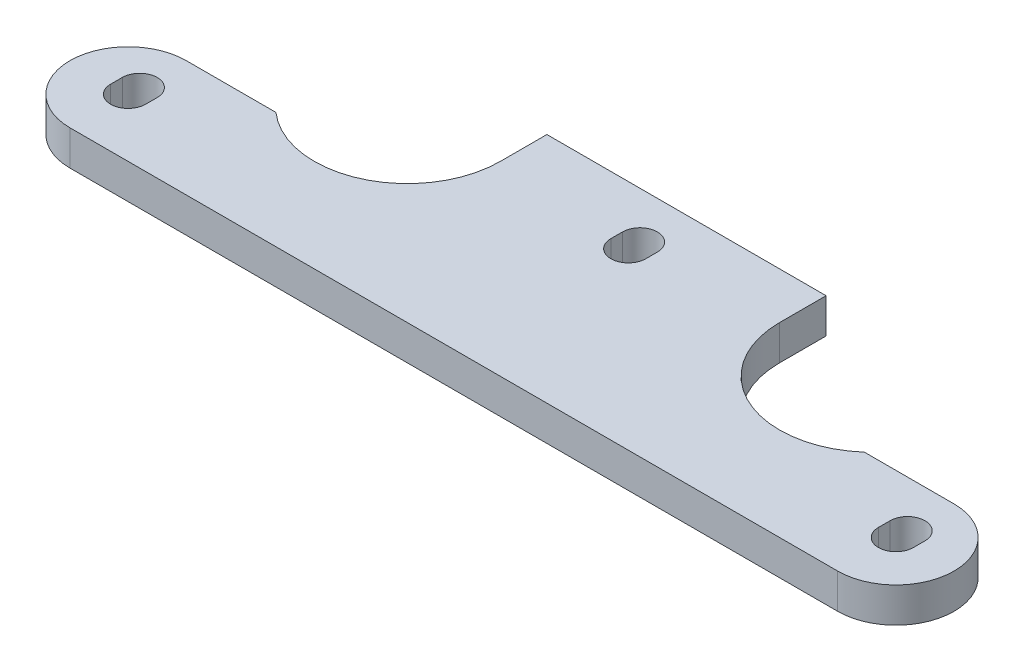
ISO-10303-21;
HEADER;
FILE_DESCRIPTION(('STEP AP214'),'2;1');
FILE_NAME('part.step','',(''),(''),'','','');
FILE_SCHEMA(('AUTOMOTIVE_DESIGN { 1 0 10303 214 1 1 1 1 }'));
ENDSEC;
DATA;
#1=APPLICATION_CONTEXT('core data for automotive mechanical design processes');
#2=APPLICATION_PROTOCOL_DEFINITION('international standard','automotive_design',2000,#1);
#3=PRODUCT_CONTEXT('',#1,'mechanical');
#4=PRODUCT('Part','Part','',(#3));
#5=PRODUCT_RELATED_PRODUCT_CATEGORY('part','',(#4));
#6=PRODUCT_DEFINITION_FORMATION('','',#4);
#7=PRODUCT_DEFINITION_CONTEXT('part definition',#1,'design');
#8=PRODUCT_DEFINITION('design','',#6,#7);
#9=PRODUCT_DEFINITION_SHAPE('','',#8);
#10=(LENGTH_UNIT() NAMED_UNIT(*) SI_UNIT(.MILLI.,.METRE.));
#11=(NAMED_UNIT(*) PLANE_ANGLE_UNIT() SI_UNIT($,.RADIAN.));
#12=(NAMED_UNIT(*) SI_UNIT($,.STERADIAN.) SOLID_ANGLE_UNIT());
#13=UNCERTAINTY_MEASURE_WITH_UNIT(LENGTH_MEASURE(1.E-05),#10,'distance_accuracy_value','');
#14=(GEOMETRIC_REPRESENTATION_CONTEXT(3) GLOBAL_UNCERTAINTY_ASSIGNED_CONTEXT((#13)) GLOBAL_UNIT_ASSIGNED_CONTEXT((#10,
#11,#12)) REPRESENTATION_CONTEXT('',''));
#15=CARTESIAN_POINT('',(0.,0.,0.));
#16=DIRECTION('',(0.,0.,1.));
#17=DIRECTION('',(1.,0.,0.));
#18=AXIS2_PLACEMENT_3D('',#15,#16,#17);
#19=CARTESIAN_POINT('',(33.,3.,-5.));
#20=DIRECTION('',(0.,-1.,0.));
#21=DIRECTION('',(0.,0.,-1.));
#22=AXIS2_PLACEMENT_3D('',#19,#20,#21);
#23=CYLINDRICAL_SURFACE('',#22,5.);
#24=CARTESIAN_POINT('',(33.,0.,-5.));
#25=DIRECTION('',(0.,1.,0.));
#26=DIRECTION('',(0.,0.,1.));
#27=AXIS2_PLACEMENT_3D('',#24,#25,#26);
#28=CIRCLE('',#27,5.);
#29=CARTESIAN_POINT('',(33.,0.,0.));
#30=VERTEX_POINT('',#29);
#31=CARTESIAN_POINT('',(33.,0.,-10.));
#32=VERTEX_POINT('',#31);
#33=EDGE_CURVE('E289',#30,#32,#28,.T.);
#34=ORIENTED_EDGE('',*,*,#33,.T.);
#35=DIRECTION('',(0.,-1.,0.));
#36=VECTOR('',#35,1.);
#37=CARTESIAN_POINT('',(33.,3.,-10.));
#38=LINE('',#37,#36);
#39=CARTESIAN_POINT('',(33.,3.,-10.));
#40=VERTEX_POINT('',#39);
#41=EDGE_CURVE('E54',#40,#32,#38,.T.);
#42=ORIENTED_EDGE('',*,*,#41,.F.);
#43=CARTESIAN_POINT('',(33.,3.,-5.));
#44=DIRECTION('',(0.,1.,0.));
#45=DIRECTION('',(0.,0.,1.));
#46=AXIS2_PLACEMENT_3D('',#43,#44,#45);
#47=CIRCLE('',#46,5.);
#48=CARTESIAN_POINT('',(33.,3.,0.));
#49=VERTEX_POINT('',#48);
#50=EDGE_CURVE('E299',#49,#40,#47,.T.);
#51=ORIENTED_EDGE('',*,*,#50,.F.);
#52=DIRECTION('',(0.,-1.,0.));
#53=VECTOR('',#52,1.);
#54=CARTESIAN_POINT('',(33.,3.,0.));
#55=LINE('',#54,#53);
#56=EDGE_CURVE('E13',#49,#30,#55,.T.);
#57=ORIENTED_EDGE('',*,*,#56,.T.);
#58=EDGE_LOOP('',(#34,#42,#51,#57));
#59=FACE_BOUND('',#58,.T.);
#60=ADVANCED_FACE('F47',(#59),#23,.T.);
#61=CARTESIAN_POINT('',(25.2915026221292,3.,-10.));
#62=DIRECTION('',(0.,0.,1.));
#63=DIRECTION('',(1.,0.,0.));
#64=AXIS2_PLACEMENT_3D('',#61,#62,#63);
#65=PLANE('',#64);
#66=DIRECTION('',(-1.,0.,0.));
#67=VECTOR('',#66,1.);
#68=CARTESIAN_POINT('',(25.2915026221292,0.,-10.));
#69=LINE('',#68,#67);
#70=CARTESIAN_POINT('',(25.2915026221292,0.,-10.));
#71=VERTEX_POINT('',#70);
#72=EDGE_CURVE('E321',#32,#71,#69,.T.);
#73=ORIENTED_EDGE('',*,*,#72,.T.);
#74=DIRECTION('',(0.,-1.,0.));
#75=VECTOR('',#74,1.);
#76=CARTESIAN_POINT('',(25.2915026221292,3.,-10.));
#77=LINE('',#76,#75);
#78=CARTESIAN_POINT('',(25.2915026221292,3.,-10.));
#79=VERTEX_POINT('',#78);
#80=EDGE_CURVE('E358',#79,#71,#77,.T.);
#81=ORIENTED_EDGE('',*,*,#80,.F.);
#82=DIRECTION('',(-1.,0.,0.));
#83=VECTOR('',#82,1.);
#84=CARTESIAN_POINT('',(25.2915026221292,3.,-10.));
#85=LINE('',#84,#83);
#86=EDGE_CURVE('E302',#40,#79,#85,.T.);
#87=ORIENTED_EDGE('',*,*,#86,.F.);
#88=ORIENTED_EDGE('',*,*,#41,.T.);
#89=EDGE_LOOP('',(#73,#81,#87,#88));
#90=FACE_BOUND('',#89,.T.);
#91=ADVANCED_FACE('F365',(#90),#65,.F.);
#92=CARTESIAN_POINT('',(20.,3.,-16.));
#93=DIRECTION('',(0.,-1.,0.));
#94=DIRECTION('',(0.,0.,-1.));
#95=AXIS2_PLACEMENT_3D('',#92,#93,#94);
#96=CYLINDRICAL_SURFACE('',#95,8.);
#97=CARTESIAN_POINT('',(20.,0.,-16.));
#98=DIRECTION('',(0.,-1.,0.));
#99=DIRECTION('',(0.,0.,1.));
#100=AXIS2_PLACEMENT_3D('',#97,#98,#99);
#101=CIRCLE('',#100,8.);
#102=CARTESIAN_POINT('',(12.,0.,-16.));
#103=VERTEX_POINT('',#102);
#104=EDGE_CURVE('E323',#71,#103,#101,.T.);
#105=ORIENTED_EDGE('',*,*,#104,.T.);
#106=DIRECTION('',(0.,-1.,0.));
#107=VECTOR('',#106,1.);
#108=CARTESIAN_POINT('',(12.,3.,-16.));
#109=LINE('',#108,#107);
#110=CARTESIAN_POINT('',(12.,3.,-16.));
#111=VERTEX_POINT('',#110);
#112=EDGE_CURVE('E355',#111,#103,#109,.T.);
#113=ORIENTED_EDGE('',*,*,#112,.F.);
#114=CARTESIAN_POINT('',(20.,3.,-16.));
#115=DIRECTION('',(0.,-1.,0.));
#116=DIRECTION('',(0.,0.,1.));
#117=AXIS2_PLACEMENT_3D('',#114,#115,#116);
#118=CIRCLE('',#117,8.);
#119=EDGE_CURVE('E304',#79,#111,#118,.T.);
#120=ORIENTED_EDGE('',*,*,#119,.F.);
#121=ORIENTED_EDGE('',*,*,#80,.T.);
#122=EDGE_LOOP('',(#105,#113,#120,#121));
#123=FACE_BOUND('',#122,.T.);
#124=ADVANCED_FACE('F376',(#123),#96,.F.);
#125=CARTESIAN_POINT('',(12.,3.,-20.));
#126=DIRECTION('',(-1.,0.,0.));
#127=DIRECTION('',(0.,0.,1.));
#128=AXIS2_PLACEMENT_3D('',#125,#126,#127);
#129=PLANE('',#128);
#130=DIRECTION('',(0.,0.,-1.));
#131=VECTOR('',#130,1.);
#132=CARTESIAN_POINT('',(12.,0.,-20.));
#133=LINE('',#132,#131);
#134=CARTESIAN_POINT('',(12.,0.,-20.));
#135=VERTEX_POINT('',#134);
#136=EDGE_CURVE('E325',#103,#135,#133,.T.);
#137=ORIENTED_EDGE('',*,*,#136,.T.);
#138=DIRECTION('',(0.,-1.,0.));
#139=VECTOR('',#138,1.);
#140=CARTESIAN_POINT('',(12.,3.,-20.));
#141=LINE('',#140,#139);
#142=CARTESIAN_POINT('',(12.,3.,-20.));
#143=VERTEX_POINT('',#142);
#144=EDGE_CURVE('E352',#143,#135,#141,.T.);
#145=ORIENTED_EDGE('',*,*,#144,.F.);
#146=DIRECTION('',(0.,0.,-1.));
#147=VECTOR('',#146,1.);
#148=CARTESIAN_POINT('',(12.,3.,-20.));
#149=LINE('',#148,#147);
#150=EDGE_CURVE('E306',#111,#143,#149,.T.);
#151=ORIENTED_EDGE('',*,*,#150,.F.);
#152=ORIENTED_EDGE('',*,*,#112,.T.);
#153=EDGE_LOOP('',(#137,#145,#151,#152));
#154=FACE_BOUND('',#153,.T.);
#155=ADVANCED_FACE('F380',(#154),#129,.F.);
#156=CARTESIAN_POINT('',(12.,3.,-20.));
#157=DIRECTION('',(0.,0.,1.));
#158=DIRECTION('',(1.,0.,0.));
#159=AXIS2_PLACEMENT_3D('',#156,#157,#158);
#160=PLANE('',#159);
#161=DIRECTION('',(-1.,0.,0.));
#162=VECTOR('',#161,1.);
#163=CARTESIAN_POINT('',(12.,0.,-20.));
#164=LINE('',#163,#162);
#165=CARTESIAN_POINT('',(-12.,0.,-20.));
#166=VERTEX_POINT('',#165);
#167=EDGE_CURVE('E327',#135,#166,#164,.T.);
#168=ORIENTED_EDGE('',*,*,#167,.T.);
#169=DIRECTION('',(0.,-1.,0.));
#170=VECTOR('',#169,1.);
#171=CARTESIAN_POINT('',(-12.,3.,-20.));
#172=LINE('',#171,#170);
#173=CARTESIAN_POINT('',(-12.,3.,-20.));
#174=VERTEX_POINT('',#173);
#175=EDGE_CURVE('E349',#174,#166,#172,.T.);
#176=ORIENTED_EDGE('',*,*,#175,.F.);
#177=DIRECTION('',(-1.,0.,0.));
#178=VECTOR('',#177,1.);
#179=CARTESIAN_POINT('',(12.,3.,-20.));
#180=LINE('',#179,#178);
#181=EDGE_CURVE('E308',#143,#174,#180,.T.);
#182=ORIENTED_EDGE('',*,*,#181,.F.);
#183=ORIENTED_EDGE('',*,*,#144,.T.);
#184=EDGE_LOOP('',(#168,#176,#182,#183));
#185=FACE_BOUND('',#184,.T.);
#186=ADVANCED_FACE('F410',(#185),#160,.F.);
#187=CARTESIAN_POINT('',(-12.,3.,-20.));
#188=DIRECTION('',(1.,0.,0.));
#189=DIRECTION('',(0.,0.,-1.));
#190=AXIS2_PLACEMENT_3D('',#187,#188,#189);
#191=PLANE('',#190);
#192=DIRECTION('',(0.,0.,1.));
#193=VECTOR('',#192,1.);
#194=CARTESIAN_POINT('',(-12.,0.,-20.));
#195=LINE('',#194,#193);
#196=CARTESIAN_POINT('',(-12.,0.,-16.));
#197=VERTEX_POINT('',#196);
#198=EDGE_CURVE('E329',#166,#197,#195,.T.);
#199=ORIENTED_EDGE('',*,*,#198,.T.);
#200=DIRECTION('',(0.,-1.,0.));
#201=VECTOR('',#200,1.);
#202=CARTESIAN_POINT('',(-12.,3.,-16.));
#203=LINE('',#202,#201);
#204=CARTESIAN_POINT('',(-12.,3.,-16.));
#205=VERTEX_POINT('',#204);
#206=EDGE_CURVE('E346',#205,#197,#203,.T.);
#207=ORIENTED_EDGE('',*,*,#206,.F.);
#208=DIRECTION('',(0.,0.,1.));
#209=VECTOR('',#208,1.);
#210=CARTESIAN_POINT('',(-12.,3.,-20.));
#211=LINE('',#210,#209);
#212=EDGE_CURVE('E310',#174,#205,#211,.T.);
#213=ORIENTED_EDGE('',*,*,#212,.F.);
#214=ORIENTED_EDGE('',*,*,#175,.T.);
#215=EDGE_LOOP('',(#199,#207,#213,#214));
#216=FACE_BOUND('',#215,.T.);
#217=ADVANCED_FACE('F407',(#216),#191,.F.);
#218=CARTESIAN_POINT('',(-20.,3.,-16.));
#219=DIRECTION('',(0.,-1.,0.));
#220=DIRECTION('',(0.,0.,-1.));
#221=AXIS2_PLACEMENT_3D('',#218,#219,#220);
#222=CYLINDRICAL_SURFACE('',#221,8.);
#223=CARTESIAN_POINT('',(-20.,0.,-16.));
#224=DIRECTION('',(0.,-1.,0.));
#225=DIRECTION('',(0.,0.,-1.));
#226=AXIS2_PLACEMENT_3D('',#223,#224,#225);
#227=CIRCLE('',#226,8.);
#228=CARTESIAN_POINT('',(-25.2915026221292,0.,-9.99999999999999));
#229=VERTEX_POINT('',#228);
#230=EDGE_CURVE('E331',#197,#229,#227,.T.);
#231=ORIENTED_EDGE('',*,*,#230,.T.);
#232=DIRECTION('',(0.,-1.,0.));
#233=VECTOR('',#232,1.);
#234=CARTESIAN_POINT('',(-25.2915026221292,3.,-9.99999999999999));
#235=LINE('',#234,#233);
#236=CARTESIAN_POINT('',(-25.2915026221292,3.,-9.99999999999999));
#237=VERTEX_POINT('',#236);
#238=EDGE_CURVE('E343',#237,#229,#235,.T.);
#239=ORIENTED_EDGE('',*,*,#238,.F.);
#240=CARTESIAN_POINT('',(-20.,3.,-16.));
#241=DIRECTION('',(0.,-1.,0.));
#242=DIRECTION('',(0.,0.,-1.));
#243=AXIS2_PLACEMENT_3D('',#240,#241,#242);
#244=CIRCLE('',#243,8.);
#245=EDGE_CURVE('E312',#205,#237,#244,.T.);
#246=ORIENTED_EDGE('',*,*,#245,.F.);
#247=ORIENTED_EDGE('',*,*,#206,.T.);
#248=EDGE_LOOP('',(#231,#239,#246,#247));
#249=FACE_BOUND('',#248,.T.);
#250=ADVANCED_FACE('F403',(#249),#222,.F.);
#251=CARTESIAN_POINT('',(-33.,3.,-10.));
#252=DIRECTION('',(0.,0.,1.));
#253=DIRECTION('',(1.,0.,0.));
#254=AXIS2_PLACEMENT_3D('',#251,#252,#253);
#255=PLANE('',#254);
#256=DIRECTION('',(-1.,0.,0.));
#257=VECTOR('',#256,1.);
#258=CARTESIAN_POINT('',(-33.,0.,-10.));
#259=LINE('',#258,#257);
#260=CARTESIAN_POINT('',(-33.,0.,-10.));
#261=VERTEX_POINT('',#260);
#262=EDGE_CURVE('E333',#229,#261,#259,.T.);
#263=ORIENTED_EDGE('',*,*,#262,.T.);
#264=DIRECTION('',(0.,-1.,0.));
#265=VECTOR('',#264,1.);
#266=CARTESIAN_POINT('',(-33.,3.,-10.));
#267=LINE('',#266,#265);
#268=CARTESIAN_POINT('',(-33.,3.,-10.));
#269=VERTEX_POINT('',#268);
#270=EDGE_CURVE('E340',#269,#261,#267,.T.);
#271=ORIENTED_EDGE('',*,*,#270,.F.);
#272=DIRECTION('',(-1.,0.,0.));
#273=VECTOR('',#272,1.);
#274=CARTESIAN_POINT('',(-33.,3.,-10.));
#275=LINE('',#274,#273);
#276=EDGE_CURVE('E314',#237,#269,#275,.T.);
#277=ORIENTED_EDGE('',*,*,#276,.F.);
#278=ORIENTED_EDGE('',*,*,#238,.T.);
#279=EDGE_LOOP('',(#263,#271,#277,#278));
#280=FACE_BOUND('',#279,.T.);
#281=ADVANCED_FACE('F399',(#280),#255,.F.);
#282=CARTESIAN_POINT('',(-33.,3.,-5.));
#283=DIRECTION('',(0.,-1.,0.));
#284=DIRECTION('',(0.,0.,-1.));
#285=AXIS2_PLACEMENT_3D('',#282,#283,#284);
#286=CYLINDRICAL_SURFACE('',#285,5.);
#287=CARTESIAN_POINT('',(-33.,0.,-5.));
#288=DIRECTION('',(0.,1.,0.));
#289=DIRECTION('',(0.,0.,-1.));
#290=AXIS2_PLACEMENT_3D('',#287,#288,#289);
#291=CIRCLE('',#290,5.);
#292=CARTESIAN_POINT('',(-33.,0.,0.));
#293=VERTEX_POINT('',#292);
#294=EDGE_CURVE('E335',#261,#293,#291,.T.);
#295=ORIENTED_EDGE('',*,*,#294,.T.);
#296=DIRECTION('',(0.,-1.,0.));
#297=VECTOR('',#296,1.);
#298=CARTESIAN_POINT('',(-33.,3.,0.));
#299=LINE('',#298,#297);
#300=CARTESIAN_POINT('',(-33.,3.,0.));
#301=VERTEX_POINT('',#300);
#302=EDGE_CURVE('E319',#301,#293,#299,.T.);
#303=ORIENTED_EDGE('',*,*,#302,.F.);
#304=CARTESIAN_POINT('',(-33.,3.,-5.));
#305=DIRECTION('',(0.,1.,0.));
#306=DIRECTION('',(0.,0.,-1.));
#307=AXIS2_PLACEMENT_3D('',#304,#305,#306);
#308=CIRCLE('',#307,5.);
#309=EDGE_CURVE('E316',#269,#301,#308,.T.);
#310=ORIENTED_EDGE('',*,*,#309,.F.);
#311=ORIENTED_EDGE('',*,*,#270,.T.);
#312=EDGE_LOOP('',(#295,#303,#310,#311));
#313=FACE_BOUND('',#312,.T.);
#314=ADVANCED_FACE('F394',(#313),#286,.T.);
#315=CARTESIAN_POINT('',(0.,3.,0.));
#316=DIRECTION('',(0.,0.,-1.));
#317=DIRECTION('',(-1.,0.,0.));
#318=AXIS2_PLACEMENT_3D('',#315,#316,#317);
#319=PLANE('',#318);
#320=DIRECTION('',(1.,0.,0.));
#321=VECTOR('',#320,1.);
#322=CARTESIAN_POINT('',(0.,0.,0.));
#323=LINE('',#322,#321);
#324=EDGE_CURVE('E300',#293,#30,#323,.T.);
#325=ORIENTED_EDGE('',*,*,#324,.T.);
#326=ORIENTED_EDGE('',*,*,#56,.F.);
#327=DIRECTION('',(1.,0.,0.));
#328=VECTOR('',#327,1.);
#329=CARTESIAN_POINT('',(0.,3.,0.));
#330=LINE('',#329,#328);
#331=EDGE_CURVE('E296',#301,#49,#330,.T.);
#332=ORIENTED_EDGE('',*,*,#331,.F.);
#333=ORIENTED_EDGE('',*,*,#302,.T.);
#334=EDGE_LOOP('',(#325,#326,#332,#333));
#335=FACE_BOUND('',#334,.T.);
#336=ADVANCED_FACE('F388',(#335),#319,.F.);
#337=CARTESIAN_POINT('',(33.,3.,-5.));
#338=DIRECTION('',(0.,1.,0.));
#339=DIRECTION('',(0.,0.,1.));
#340=AXIS2_PLACEMENT_3D('',#337,#338,#339);
#341=PLANE('',#340);
#342=CARTESIAN_POINT('',(0.,3.,-15.));
#343=DIRECTION('',(0.,1.,0.));
#344=DIRECTION('',(0.,0.,1.));
#345=AXIS2_PLACEMENT_3D('',#342,#343,#344);
#346=CIRCLE('',#345,1.5);
#347=CARTESIAN_POINT('',(-1.5,3.,-15.));
#348=VERTEX_POINT('',#347);
#349=CARTESIAN_POINT('',(1.5,3.,-15.));
#350=VERTEX_POINT('',#349);
#351=EDGE_CURVE('E61',#348,#350,#346,.T.);
#352=ORIENTED_EDGE('',*,*,#351,.F.);
#353=DIRECTION('',(0.,0.,1.));
#354=VECTOR('',#353,1.);
#355=CARTESIAN_POINT('',(-1.5,3.,-15.));
#356=LINE('',#355,#354);
#357=CARTESIAN_POINT('',(-1.5,3.,-16.));
#358=VERTEX_POINT('',#357);
#359=EDGE_CURVE('E213',#358,#348,#356,.T.);
#360=ORIENTED_EDGE('',*,*,#359,.F.);
#361=CARTESIAN_POINT('',(0.,3.,-16.));
#362=DIRECTION('',(0.,1.,0.));
#363=DIRECTION('',(0.,0.,1.));
#364=AXIS2_PLACEMENT_3D('',#361,#362,#363);
#365=CIRCLE('',#364,1.5);
#366=CARTESIAN_POINT('',(1.5,3.,-16.));
#367=VERTEX_POINT('',#366);
#368=EDGE_CURVE('E216',#367,#358,#365,.T.);
#369=ORIENTED_EDGE('',*,*,#368,.F.);
#370=DIRECTION('',(0.,0.,-1.));
#371=VECTOR('',#370,1.);
#372=CARTESIAN_POINT('',(1.5,3.,-15.));
#373=LINE('',#372,#371);
#374=EDGE_CURVE('E222',#350,#367,#373,.T.);
#375=ORIENTED_EDGE('',*,*,#374,.F.);
#376=EDGE_LOOP('',(#352,#360,#369,#375));
#377=FACE_BOUND('',#376,.T.);
#378=CARTESIAN_POINT('',(33.,3.,-5.));
#379=DIRECTION('',(0.,1.,0.));
#380=DIRECTION('',(0.,0.,1.));
#381=AXIS2_PLACEMENT_3D('',#378,#379,#380);
#382=CIRCLE('',#381,1.5);
#383=CARTESIAN_POINT('',(31.5,3.,-5.));
#384=VERTEX_POINT('',#383);
#385=CARTESIAN_POINT('',(34.5,3.,-5.));
#386=VERTEX_POINT('',#385);
#387=EDGE_CURVE('E228',#384,#386,#382,.T.);
#388=ORIENTED_EDGE('',*,*,#387,.F.);
#389=DIRECTION('',(0.,0.,1.));
#390=VECTOR('',#389,1.);
#391=CARTESIAN_POINT('',(31.5,3.,-5.));
#392=LINE('',#391,#390);
#393=CARTESIAN_POINT('',(31.5,3.,-6.));
#394=VERTEX_POINT('',#393);
#395=EDGE_CURVE('E236',#394,#384,#392,.T.);
#396=ORIENTED_EDGE('',*,*,#395,.F.);
#397=CARTESIAN_POINT('',(33.,3.,-6.));
#398=DIRECTION('',(0.,1.,0.));
#399=DIRECTION('',(0.,0.,1.));
#400=AXIS2_PLACEMENT_3D('',#397,#398,#399);
#401=CIRCLE('',#400,1.5);
#402=CARTESIAN_POINT('',(34.5,3.,-6.));
#403=VERTEX_POINT('',#402);
#404=EDGE_CURVE('E250',#403,#394,#401,.T.);
#405=ORIENTED_EDGE('',*,*,#404,.F.);
#406=DIRECTION('',(0.,0.,-1.));
#407=VECTOR('',#406,1.);
#408=CARTESIAN_POINT('',(34.5,3.,-5.));
#409=LINE('',#408,#407);
#410=EDGE_CURVE('E247',#386,#403,#409,.T.);
#411=ORIENTED_EDGE('',*,*,#410,.F.);
#412=EDGE_LOOP('',(#388,#396,#405,#411));
#413=FACE_BOUND('',#412,.T.);
#414=CARTESIAN_POINT('',(-33.,3.,-5.));
#415=DIRECTION('',(0.,1.,0.));
#416=DIRECTION('',(0.,0.,1.));
#417=AXIS2_PLACEMENT_3D('',#414,#415,#416);
#418=CIRCLE('',#417,1.5);
#419=CARTESIAN_POINT('',(-34.5,3.,-5.));
#420=VERTEX_POINT('',#419);
#421=CARTESIAN_POINT('',(-31.5,3.,-5.));
#422=VERTEX_POINT('',#421);
#423=EDGE_CURVE('E257',#420,#422,#418,.T.);
#424=ORIENTED_EDGE('',*,*,#423,.F.);
#425=DIRECTION('',(0.,0.,1.));
#426=VECTOR('',#425,1.);
#427=CARTESIAN_POINT('',(-34.5,3.,-5.));
#428=LINE('',#427,#426);
#429=CARTESIAN_POINT('',(-34.5,3.,-6.));
#430=VERTEX_POINT('',#429);
#431=EDGE_CURVE('E268',#430,#420,#428,.T.);
#432=ORIENTED_EDGE('',*,*,#431,.F.);
#433=CARTESIAN_POINT('',(-33.,3.,-6.));
#434=DIRECTION('',(0.,1.,0.));
#435=DIRECTION('',(0.,0.,1.));
#436=AXIS2_PLACEMENT_3D('',#433,#434,#435);
#437=CIRCLE('',#436,1.5);
#438=CARTESIAN_POINT('',(-31.5,3.,-6.));
#439=VERTEX_POINT('',#438);
#440=EDGE_CURVE('E282',#439,#430,#437,.T.);
#441=ORIENTED_EDGE('',*,*,#440,.F.);
#442=DIRECTION('',(0.,0.,-1.));
#443=VECTOR('',#442,1.);
#444=CARTESIAN_POINT('',(-31.5,3.,-5.));
#445=LINE('',#444,#443);
#446=EDGE_CURVE('E279',#422,#439,#445,.T.);
#447=ORIENTED_EDGE('',*,*,#446,.F.);
#448=EDGE_LOOP('',(#424,#432,#441,#447));
#449=FACE_BOUND('',#448,.T.);
#450=ORIENTED_EDGE('',*,*,#331,.T.);
#451=ORIENTED_EDGE('',*,*,#50,.T.);
#452=ORIENTED_EDGE('',*,*,#86,.T.);
#453=ORIENTED_EDGE('',*,*,#119,.T.);
#454=ORIENTED_EDGE('',*,*,#150,.T.);
#455=ORIENTED_EDGE('',*,*,#181,.T.);
#456=ORIENTED_EDGE('',*,*,#212,.T.);
#457=ORIENTED_EDGE('',*,*,#245,.T.);
#458=ORIENTED_EDGE('',*,*,#276,.T.);
#459=ORIENTED_EDGE('',*,*,#309,.T.);
#460=EDGE_LOOP('',(#450,#451,#452,#453,#454,#455,#456,#457,#458,#459));
#461=FACE_BOUND('',#460,.T.);
#462=ADVANCED_FACE('F384',(#377,#413,#449,#461),#341,.T.);
#463=CARTESIAN_POINT('',(33.,0.,-5.));
#464=DIRECTION('',(0.,1.,0.));
#465=DIRECTION('',(0.,0.,1.));
#466=AXIS2_PLACEMENT_3D('',#463,#464,#465);
#467=PLANE('',#466);
#468=DIRECTION('',(0.,0.,1.));
#469=VECTOR('',#468,1.);
#470=CARTESIAN_POINT('',(-1.5,0.,-15.));
#471=LINE('',#470,#469);
#472=CARTESIAN_POINT('',(-1.5,0.,-16.));
#473=VERTEX_POINT('',#472);
#474=CARTESIAN_POINT('',(-1.5,0.,-15.));
#475=VERTEX_POINT('',#474);
#476=EDGE_CURVE('E203',#473,#475,#471,.T.);
#477=ORIENTED_EDGE('',*,*,#476,.T.);
#478=CARTESIAN_POINT('',(0.,0.,-15.));
#479=DIRECTION('',(0.,1.,0.));
#480=DIRECTION('',(0.,0.,1.));
#481=AXIS2_PLACEMENT_3D('',#478,#479,#480);
#482=CIRCLE('',#481,1.5);
#483=CARTESIAN_POINT('',(1.5,0.,-15.));
#484=VERTEX_POINT('',#483);
#485=EDGE_CURVE('E197',#475,#484,#482,.T.);
#486=ORIENTED_EDGE('',*,*,#485,.T.);
#487=DIRECTION('',(0.,0.,-1.));
#488=VECTOR('',#487,1.);
#489=CARTESIAN_POINT('',(1.5,0.,-15.));
#490=LINE('',#489,#488);
#491=CARTESIAN_POINT('',(1.5,0.,-16.));
#492=VERTEX_POINT('',#491);
#493=EDGE_CURVE('E206',#484,#492,#490,.T.);
#494=ORIENTED_EDGE('',*,*,#493,.T.);
#495=CARTESIAN_POINT('',(0.,0.,-16.));
#496=DIRECTION('',(0.,1.,0.));
#497=DIRECTION('',(0.,0.,1.));
#498=AXIS2_PLACEMENT_3D('',#495,#496,#497);
#499=CIRCLE('',#498,1.5);
#500=EDGE_CURVE('E69',#492,#473,#499,.T.);
#501=ORIENTED_EDGE('',*,*,#500,.T.);
#502=EDGE_LOOP('',(#477,#486,#494,#501));
#503=FACE_BOUND('',#502,.T.);
#504=DIRECTION('',(0.,0.,1.));
#505=VECTOR('',#504,1.);
#506=CARTESIAN_POINT('',(31.5,0.,-5.));
#507=LINE('',#506,#505);
#508=CARTESIAN_POINT('',(31.5,0.,-6.));
#509=VERTEX_POINT('',#508);
#510=CARTESIAN_POINT('',(31.5,0.,-5.));
#511=VERTEX_POINT('',#510);
#512=EDGE_CURVE('E242',#509,#511,#507,.T.);
#513=ORIENTED_EDGE('',*,*,#512,.T.);
#514=CARTESIAN_POINT('',(33.,0.,-5.));
#515=DIRECTION('',(0.,1.,0.));
#516=DIRECTION('',(0.,0.,1.));
#517=AXIS2_PLACEMENT_3D('',#514,#515,#516);
#518=CIRCLE('',#517,1.5);
#519=CARTESIAN_POINT('',(34.5,0.,-5.));
#520=VERTEX_POINT('',#519);
#521=EDGE_CURVE('E232',#511,#520,#518,.T.);
#522=ORIENTED_EDGE('',*,*,#521,.T.);
#523=DIRECTION('',(0.,0.,-1.));
#524=VECTOR('',#523,1.);
#525=CARTESIAN_POINT('',(34.5,0.,-5.));
#526=LINE('',#525,#524);
#527=CARTESIAN_POINT('',(34.5,0.,-6.));
#528=VERTEX_POINT('',#527);
#529=EDGE_CURVE('E235',#520,#528,#526,.T.);
#530=ORIENTED_EDGE('',*,*,#529,.T.);
#531=CARTESIAN_POINT('',(33.,0.,-6.));
#532=DIRECTION('',(0.,1.,0.));
#533=DIRECTION('',(0.,0.,1.));
#534=AXIS2_PLACEMENT_3D('',#531,#532,#533);
#535=CIRCLE('',#534,1.5);
#536=EDGE_CURVE('E239',#528,#509,#535,.T.);
#537=ORIENTED_EDGE('',*,*,#536,.T.);
#538=EDGE_LOOP('',(#513,#522,#530,#537));
#539=FACE_BOUND('',#538,.T.);
#540=DIRECTION('',(0.,0.,1.));
#541=VECTOR('',#540,1.);
#542=CARTESIAN_POINT('',(-34.5,0.,-5.));
#543=LINE('',#542,#541);
#544=CARTESIAN_POINT('',(-34.5,0.,-6.));
#545=VERTEX_POINT('',#544);
#546=CARTESIAN_POINT('',(-34.5,0.,-5.));
#547=VERTEX_POINT('',#546);
#548=EDGE_CURVE('E274',#545,#547,#543,.T.);
#549=ORIENTED_EDGE('',*,*,#548,.T.);
#550=CARTESIAN_POINT('',(-33.,0.,-5.));
#551=DIRECTION('',(0.,1.,0.));
#552=DIRECTION('',(0.,0.,1.));
#553=AXIS2_PLACEMENT_3D('',#550,#551,#552);
#554=CIRCLE('',#553,1.5);
#555=CARTESIAN_POINT('',(-31.5,0.,-5.));
#556=VERTEX_POINT('',#555);
#557=EDGE_CURVE('E264',#547,#556,#554,.T.);
#558=ORIENTED_EDGE('',*,*,#557,.T.);
#559=DIRECTION('',(0.,0.,-1.));
#560=VECTOR('',#559,1.);
#561=CARTESIAN_POINT('',(-31.5,0.,-5.));
#562=LINE('',#561,#560);
#563=CARTESIAN_POINT('',(-31.5,0.,-6.));
#564=VERTEX_POINT('',#563);
#565=EDGE_CURVE('E267',#556,#564,#562,.T.);
#566=ORIENTED_EDGE('',*,*,#565,.T.);
#567=CARTESIAN_POINT('',(-33.,0.,-6.));
#568=DIRECTION('',(0.,1.,0.));
#569=DIRECTION('',(0.,0.,1.));
#570=AXIS2_PLACEMENT_3D('',#567,#568,#569);
#571=CIRCLE('',#570,1.5);
#572=EDGE_CURVE('E271',#564,#545,#571,.T.);
#573=ORIENTED_EDGE('',*,*,#572,.T.);
#574=EDGE_LOOP('',(#549,#558,#566,#573));
#575=FACE_BOUND('',#574,.T.);
#576=ORIENTED_EDGE('',*,*,#33,.F.);
#577=ORIENTED_EDGE('',*,*,#324,.F.);
#578=ORIENTED_EDGE('',*,*,#294,.F.);
#579=ORIENTED_EDGE('',*,*,#262,.F.);
#580=ORIENTED_EDGE('',*,*,#230,.F.);
#581=ORIENTED_EDGE('',*,*,#198,.F.);
#582=ORIENTED_EDGE('',*,*,#167,.F.);
#583=ORIENTED_EDGE('',*,*,#136,.F.);
#584=ORIENTED_EDGE('',*,*,#104,.F.);
#585=ORIENTED_EDGE('',*,*,#72,.F.);
#586=EDGE_LOOP('',(#576,#577,#578,#579,#580,#581,#582,#583,#584,#585));
#587=FACE_BOUND('',#586,.T.);
#588=ADVANCED_FACE('F210',(#503,#539,#575,#587),#467,.F.);
#589=CARTESIAN_POINT('',(-33.,0.,-5.));
#590=DIRECTION('',(0.,1.,0.));
#591=DIRECTION('',(0.,0.,1.));
#592=AXIS2_PLACEMENT_3D('',#589,#590,#591);
#593=CYLINDRICAL_SURFACE('',#592,1.5);
#594=ORIENTED_EDGE('',*,*,#423,.T.);
#595=DIRECTION('',(0.,1.,0.));
#596=VECTOR('',#595,1.);
#597=CARTESIAN_POINT('',(-31.5,0.,-5.));
#598=LINE('',#597,#596);
#599=EDGE_CURVE('E277',#556,#422,#598,.T.);
#600=ORIENTED_EDGE('',*,*,#599,.F.);
#601=ORIENTED_EDGE('',*,*,#557,.F.);
#602=DIRECTION('',(0.,1.,0.));
#603=VECTOR('',#602,1.);
#604=CARTESIAN_POINT('',(-34.5,0.,-5.));
#605=LINE('',#604,#603);
#606=EDGE_CURVE('E287',#547,#420,#605,.T.);
#607=ORIENTED_EDGE('',*,*,#606,.T.);
#608=EDGE_LOOP('',(#594,#600,#601,#607));
#609=FACE_BOUND('',#608,.T.);
#610=ADVANCED_FACE('F494',(#609),#593,.F.);
#611=CARTESIAN_POINT('',(-34.5,0.,-5.));
#612=DIRECTION('',(-1.,0.,0.));
#613=DIRECTION('',(0.,0.,1.));
#614=AXIS2_PLACEMENT_3D('',#611,#612,#613);
#615=PLANE('',#614);
#616=ORIENTED_EDGE('',*,*,#431,.T.);
#617=ORIENTED_EDGE('',*,*,#606,.F.);
#618=ORIENTED_EDGE('',*,*,#548,.F.);
#619=DIRECTION('',(0.,1.,0.));
#620=VECTOR('',#619,1.);
#621=CARTESIAN_POINT('',(-34.5,0.,-6.));
#622=LINE('',#621,#620);
#623=EDGE_CURVE('E290',#545,#430,#622,.T.);
#624=ORIENTED_EDGE('',*,*,#623,.T.);
#625=EDGE_LOOP('',(#616,#617,#618,#624));
#626=FACE_BOUND('',#625,.T.);
#627=ADVANCED_FACE('F503',(#626),#615,.F.);
#628=CARTESIAN_POINT('',(-33.,0.,-6.));
#629=DIRECTION('',(0.,1.,0.));
#630=DIRECTION('',(0.,0.,1.));
#631=AXIS2_PLACEMENT_3D('',#628,#629,#630);
#632=CYLINDRICAL_SURFACE('',#631,1.5);
#633=ORIENTED_EDGE('',*,*,#440,.T.);
#634=ORIENTED_EDGE('',*,*,#623,.F.);
#635=ORIENTED_EDGE('',*,*,#572,.F.);
#636=DIRECTION('',(0.,1.,0.));
#637=VECTOR('',#636,1.);
#638=CARTESIAN_POINT('',(-31.5,0.,-6.));
#639=LINE('',#638,#637);
#640=EDGE_CURVE('E292',#564,#439,#639,.T.);
#641=ORIENTED_EDGE('',*,*,#640,.T.);
#642=EDGE_LOOP('',(#633,#634,#635,#641));
#643=FACE_BOUND('',#642,.T.);
#644=ADVANCED_FACE('F513',(#643),#632,.F.);
#645=CARTESIAN_POINT('',(-31.5,0.,-5.));
#646=DIRECTION('',(1.,0.,0.));
#647=DIRECTION('',(0.,0.,-1.));
#648=AXIS2_PLACEMENT_3D('',#645,#646,#647);
#649=PLANE('',#648);
#650=ORIENTED_EDGE('',*,*,#446,.T.);
#651=ORIENTED_EDGE('',*,*,#640,.F.);
#652=ORIENTED_EDGE('',*,*,#565,.F.);
#653=ORIENTED_EDGE('',*,*,#599,.T.);
#654=EDGE_LOOP('',(#650,#651,#652,#653));
#655=FACE_BOUND('',#654,.T.);
#656=ADVANCED_FACE('F523',(#655),#649,.F.);
#657=CARTESIAN_POINT('',(33.,0.,-5.));
#658=DIRECTION('',(0.,1.,0.));
#659=DIRECTION('',(0.,0.,1.));
#660=AXIS2_PLACEMENT_3D('',#657,#658,#659);
#661=CYLINDRICAL_SURFACE('',#660,1.5);
#662=ORIENTED_EDGE('',*,*,#387,.T.);
#663=DIRECTION('',(0.,1.,0.));
#664=VECTOR('',#663,1.);
#665=CARTESIAN_POINT('',(34.5,0.,-5.));
#666=LINE('',#665,#664);
#667=EDGE_CURVE('E245',#520,#386,#666,.T.);
#668=ORIENTED_EDGE('',*,*,#667,.F.);
#669=ORIENTED_EDGE('',*,*,#521,.F.);
#670=DIRECTION('',(0.,1.,0.));
#671=VECTOR('',#670,1.);
#672=CARTESIAN_POINT('',(31.5,0.,-5.));
#673=LINE('',#672,#671);
#674=EDGE_CURVE('E255',#511,#384,#673,.T.);
#675=ORIENTED_EDGE('',*,*,#674,.T.);
#676=EDGE_LOOP('',(#662,#668,#669,#675));
#677=FACE_BOUND('',#676,.T.);
#678=ADVANCED_FACE('F533',(#677),#661,.F.);
#679=CARTESIAN_POINT('',(31.5,0.,-5.));
#680=DIRECTION('',(-1.,0.,0.));
#681=DIRECTION('',(0.,0.,1.));
#682=AXIS2_PLACEMENT_3D('',#679,#680,#681);
#683=PLANE('',#682);
#684=ORIENTED_EDGE('',*,*,#395,.T.);
#685=ORIENTED_EDGE('',*,*,#674,.F.);
#686=ORIENTED_EDGE('',*,*,#512,.F.);
#687=DIRECTION('',(0.,1.,0.));
#688=VECTOR('',#687,1.);
#689=CARTESIAN_POINT('',(31.5,0.,-6.));
#690=LINE('',#689,#688);
#691=EDGE_CURVE('E258',#509,#394,#690,.T.);
#692=ORIENTED_EDGE('',*,*,#691,.T.);
#693=EDGE_LOOP('',(#684,#685,#686,#692));
#694=FACE_BOUND('',#693,.T.);
#695=ADVANCED_FACE('F543',(#694),#683,.F.);
#696=CARTESIAN_POINT('',(33.,0.,-6.));
#697=DIRECTION('',(0.,1.,0.));
#698=DIRECTION('',(0.,0.,1.));
#699=AXIS2_PLACEMENT_3D('',#696,#697,#698);
#700=CYLINDRICAL_SURFACE('',#699,1.5);
#701=ORIENTED_EDGE('',*,*,#404,.T.);
#702=ORIENTED_EDGE('',*,*,#691,.F.);
#703=ORIENTED_EDGE('',*,*,#536,.F.);
#704=DIRECTION('',(0.,1.,0.));
#705=VECTOR('',#704,1.);
#706=CARTESIAN_POINT('',(34.5,0.,-6.));
#707=LINE('',#706,#705);
#708=EDGE_CURVE('E260',#528,#403,#707,.T.);
#709=ORIENTED_EDGE('',*,*,#708,.T.);
#710=EDGE_LOOP('',(#701,#702,#703,#709));
#711=FACE_BOUND('',#710,.T.);
#712=ADVANCED_FACE('F553',(#711),#700,.F.);
#713=CARTESIAN_POINT('',(34.5,0.,-5.));
#714=DIRECTION('',(1.,0.,0.));
#715=DIRECTION('',(0.,0.,-1.));
#716=AXIS2_PLACEMENT_3D('',#713,#714,#715);
#717=PLANE('',#716);
#718=ORIENTED_EDGE('',*,*,#410,.T.);
#719=ORIENTED_EDGE('',*,*,#708,.F.);
#720=ORIENTED_EDGE('',*,*,#529,.F.);
#721=ORIENTED_EDGE('',*,*,#667,.T.);
#722=EDGE_LOOP('',(#718,#719,#720,#721));
#723=FACE_BOUND('',#722,.T.);
#724=ADVANCED_FACE('F563',(#723),#717,.F.);
#725=CARTESIAN_POINT('',(0.,0.,-15.));
#726=DIRECTION('',(0.,1.,0.));
#727=DIRECTION('',(0.,0.,1.));
#728=AXIS2_PLACEMENT_3D('',#725,#726,#727);
#729=CYLINDRICAL_SURFACE('',#728,1.5);
#730=ORIENTED_EDGE('',*,*,#351,.T.);
#731=DIRECTION('',(0.,1.,0.));
#732=VECTOR('',#731,1.);
#733=CARTESIAN_POINT('',(1.5,0.,-15.));
#734=LINE('',#733,#732);
#735=EDGE_CURVE('E193',#484,#350,#734,.T.);
#736=ORIENTED_EDGE('',*,*,#735,.F.);
#737=ORIENTED_EDGE('',*,*,#485,.F.);
#738=DIRECTION('',(0.,1.,0.));
#739=VECTOR('',#738,1.);
#740=CARTESIAN_POINT('',(-1.5,0.,-15.));
#741=LINE('',#740,#739);
#742=EDGE_CURVE('E226',#475,#348,#741,.T.);
#743=ORIENTED_EDGE('',*,*,#742,.T.);
#744=EDGE_LOOP('',(#730,#736,#737,#743));
#745=FACE_BOUND('',#744,.T.);
#746=ADVANCED_FACE('F195',(#745),#729,.F.);
#747=CARTESIAN_POINT('',(-1.5,0.,-15.));
#748=DIRECTION('',(-1.,0.,0.));
#749=DIRECTION('',(0.,0.,1.));
#750=AXIS2_PLACEMENT_3D('',#747,#748,#749);
#751=PLANE('',#750);
#752=ORIENTED_EDGE('',*,*,#359,.T.);
#753=ORIENTED_EDGE('',*,*,#742,.F.);
#754=ORIENTED_EDGE('',*,*,#476,.F.);
#755=DIRECTION('',(0.,1.,0.));
#756=VECTOR('',#755,1.);
#757=CARTESIAN_POINT('',(-1.5,0.,-16.));
#758=LINE('',#757,#756);
#759=EDGE_CURVE('E229',#473,#358,#758,.T.);
#760=ORIENTED_EDGE('',*,*,#759,.T.);
#761=EDGE_LOOP('',(#752,#753,#754,#760));
#762=FACE_BOUND('',#761,.T.);
#763=ADVANCED_FACE('F582',(#762),#751,.F.);
#764=CARTESIAN_POINT('',(0.,0.,-16.));
#765=DIRECTION('',(0.,1.,0.));
#766=DIRECTION('',(0.,0.,1.));
#767=AXIS2_PLACEMENT_3D('',#764,#765,#766);
#768=CYLINDRICAL_SURFACE('',#767,1.5);
#769=ORIENTED_EDGE('',*,*,#368,.T.);
#770=ORIENTED_EDGE('',*,*,#759,.F.);
#771=ORIENTED_EDGE('',*,*,#500,.F.);
#772=DIRECTION('',(0.,1.,0.));
#773=VECTOR('',#772,1.);
#774=CARTESIAN_POINT('',(1.5,0.,-16.));
#775=LINE('',#774,#773);
#776=EDGE_CURVE('E202',#492,#367,#775,.T.);
#777=ORIENTED_EDGE('',*,*,#776,.T.);
#778=EDGE_LOOP('',(#769,#770,#771,#777));
#779=FACE_BOUND('',#778,.T.);
#780=ADVANCED_FACE('F591',(#779),#768,.F.);
#781=CARTESIAN_POINT('',(1.5,0.,-15.));
#782=DIRECTION('',(1.,0.,0.));
#783=DIRECTION('',(0.,0.,-1.));
#784=AXIS2_PLACEMENT_3D('',#781,#782,#783);
#785=PLANE('',#784);
#786=ORIENTED_EDGE('',*,*,#374,.T.);
#787=ORIENTED_EDGE('',*,*,#776,.F.);
#788=ORIENTED_EDGE('',*,*,#493,.F.);
#789=ORIENTED_EDGE('',*,*,#735,.T.);
#790=EDGE_LOOP('',(#786,#787,#788,#789));
#791=FACE_BOUND('',#790,.T.);
#792=ADVANCED_FACE('F207',(#791),#785,.F.);
#793=CLOSED_SHELL('',(#60,#91,#124,#155,#186,#217,#250,#281,#314,#336,#462,#588,#610,#627,#644,
#656,#678,#695,#712,#724,#746,#763,#780,#792));
#794=MANIFOLD_SOLID_BREP('B2',#793);
#795=ADVANCED_BREP_SHAPE_REPRESENTATION('',(#18,#794),#14);
#796=SHAPE_DEFINITION_REPRESENTATION(#9,#795);
ENDSEC;
END-ISO-10303-21;
